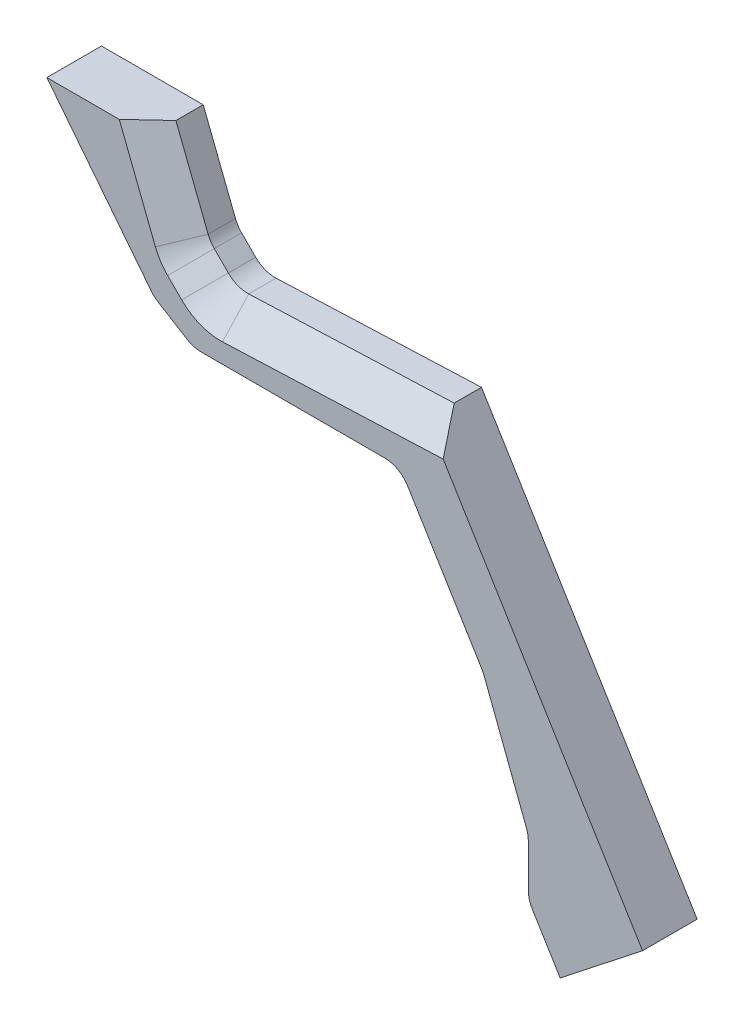
ISO-10303-21;
HEADER;
FILE_DESCRIPTION(('STEP AP214'),'2;1');
FILE_NAME('part.step','',(''),(''),'','','');
FILE_SCHEMA(('AUTOMOTIVE_DESIGN { 1 0 10303 214 1 1 1 1 }'));
ENDSEC;
DATA;
#1=APPLICATION_CONTEXT('core data for automotive mechanical design processes');
#2=APPLICATION_PROTOCOL_DEFINITION('international standard','automotive_design',2000,#1);
#3=PRODUCT_CONTEXT('',#1,'mechanical');
#4=PRODUCT('Part','Part','',(#3));
#5=PRODUCT_RELATED_PRODUCT_CATEGORY('part','',(#4));
#6=PRODUCT_DEFINITION_FORMATION('','',#4);
#7=PRODUCT_DEFINITION_CONTEXT('part definition',#1,'design');
#8=PRODUCT_DEFINITION('design','',#6,#7);
#9=PRODUCT_DEFINITION_SHAPE('','',#8);
#10=(LENGTH_UNIT() NAMED_UNIT(*) SI_UNIT(.MILLI.,.METRE.));
#11=(NAMED_UNIT(*) PLANE_ANGLE_UNIT() SI_UNIT($,.RADIAN.));
#12=(NAMED_UNIT(*) SI_UNIT($,.STERADIAN.) SOLID_ANGLE_UNIT());
#13=UNCERTAINTY_MEASURE_WITH_UNIT(LENGTH_MEASURE(1.E-05),#10,'distance_accuracy_value','');
#14=(GEOMETRIC_REPRESENTATION_CONTEXT(3) GLOBAL_UNCERTAINTY_ASSIGNED_CONTEXT((#13)) GLOBAL_UNIT_ASSIGNED_CONTEXT((#10,
#11,#12)) REPRESENTATION_CONTEXT('',''));
#15=CARTESIAN_POINT('',(0.,0.,0.));
#16=DIRECTION('',(0.,0.,1.));
#17=DIRECTION('',(1.,0.,0.));
#18=AXIS2_PLACEMENT_3D('',#15,#16,#17);
#19=CARTESIAN_POINT('',(656.038853698282,14.6313738858971,-6.35));
#20=DIRECTION('',(0.618333411134521,-0.785915894148189,0.));
#21=DIRECTION('',(0.785915894148189,0.618333411134521,0.));
#22=AXIS2_PLACEMENT_3D('',#19,#20,#21);
#23=PLANE('',#22);
#24=DIRECTION('',(0.,0.,1.));
#25=VECTOR('',#24,1.);
#26=CARTESIAN_POINT('',(675.181083360781,29.6918660480542,-6.35));
#27=LINE('',#26,#25);
#28=CARTESIAN_POINT('',(675.181083360781,29.6918660480542,-6.35));
#29=VERTEX_POINT('',#28);
#30=CARTESIAN_POINT('',(675.181083360781,29.6918660480542,6.35));
#31=VERTEX_POINT('',#30);
#32=EDGE_CURVE('E196',#29,#31,#27,.T.);
#33=ORIENTED_EDGE('',*,*,#32,.T.);
#34=DIRECTION('',(0.785915894148189,0.618333411134521,0.));
#35=VECTOR('',#34,1.);
#36=CARTESIAN_POINT('',(656.038853698282,14.6313738858971,6.35));
#37=LINE('',#36,#35);
#38=CARTESIAN_POINT('',(656.038853698282,14.6313738858971,6.35));
#39=VERTEX_POINT('',#38);
#40=EDGE_CURVE('E200',#39,#31,#37,.T.);
#41=ORIENTED_EDGE('',*,*,#40,.F.);
#42=DIRECTION('',(0.,0.,1.));
#43=VECTOR('',#42,1.);
#44=CARTESIAN_POINT('',(656.038853698282,14.6313738858971,-6.35));
#45=LINE('',#44,#43);
#46=CARTESIAN_POINT('',(656.038853698282,14.6313738858971,-6.35));
#47=VERTEX_POINT('',#46);
#48=EDGE_CURVE('E318',#47,#39,#45,.T.);
#49=ORIENTED_EDGE('',*,*,#48,.F.);
#50=DIRECTION('',(0.785915894148189,0.618333411134521,0.));
#51=VECTOR('',#50,1.);
#52=CARTESIAN_POINT('',(656.038853698282,14.6313738858971,-6.35));
#53=LINE('',#52,#51);
#54=EDGE_CURVE('E202',#47,#29,#53,.T.);
#55=ORIENTED_EDGE('',*,*,#54,.T.);
#56=EDGE_LOOP('',(#33,#41,#49,#55));
#57=FACE_BOUND('',#56,.T.);
#58=ADVANCED_FACE('F33',(#57),#23,.T.);
#59=CARTESIAN_POINT('',(652.382425553719,20.6127664439306,-6.35));
#60=DIRECTION('',(-0.853209935163297,-0.521567643301079,0.));
#61=DIRECTION('',(0.521567643301079,-0.853209935163298,0.));
#62=AXIS2_PLACEMENT_3D('',#59,#60,#61);
#63=PLANE('',#62);
#64=ORIENTED_EDGE('',*,*,#48,.T.);
#65=DIRECTION('',(0.521567643301079,-0.853209935163297,0.));
#66=VECTOR('',#65,1.);
#67=CARTESIAN_POINT('',(649.559170864999,25.231206603803,6.35));
#68=LINE('',#67,#66);
#69=CARTESIAN_POINT('',(649.559170864999,25.231206603803,6.35));
#70=VERTEX_POINT('',#69);
#71=EDGE_CURVE('E221',#70,#39,#68,.T.);
#72=ORIENTED_EDGE('',*,*,#71,.F.);
#73=DIRECTION('',(0.,0.,1.));
#74=VECTOR('',#73,1.);
#75=CARTESIAN_POINT('',(649.559170864999,25.231206603803,-6.35));
#76=LINE('',#75,#74);
#77=CARTESIAN_POINT('',(649.559170864999,25.231206603803,-6.35));
#78=VERTEX_POINT('',#77);
#79=EDGE_CURVE('E321',#78,#70,#76,.T.);
#80=ORIENTED_EDGE('',*,*,#79,.F.);
#81=DIRECTION('',(0.521567643301079,-0.853209935163297,0.));
#82=VECTOR('',#81,1.);
#83=CARTESIAN_POINT('',(649.559170864999,25.231206603803,-6.35));
#84=LINE('',#83,#82);
#85=EDGE_CURVE('E207',#78,#47,#84,.T.);
#86=ORIENTED_EDGE('',*,*,#85,.T.);
#87=EDGE_LOOP('',(#64,#72,#80,#86));
#88=FACE_BOUND('',#87,.T.);
#89=ADVANCED_FACE('F465',(#88),#63,.T.);
#90=CARTESIAN_POINT('',(654.977053953286,28.5431611387648,-6.35));
#91=DIRECTION('',(0.,0.,1.));
#92=DIRECTION('',(1.,0.,0.));
#93=AXIS2_PLACEMENT_3D('',#90,#91,#92);
#94=CYLINDRICAL_SURFACE('',#93,6.34999999999998);
#95=ORIENTED_EDGE('',*,*,#79,.T.);
#96=CARTESIAN_POINT('',(654.977053953286,28.5431611387648,6.35));
#97=DIRECTION('',(0.,0.,1.));
#98=DIRECTION('',(1.,0.,0.));
#99=AXIS2_PLACEMENT_3D('',#96,#97,#98);
#100=CIRCLE('',#99,6.34999999999998);
#101=CARTESIAN_POINT('',(648.627053953286,28.5431611387649,6.35));
#102=VERTEX_POINT('',#101);
#103=EDGE_CURVE('E261',#102,#70,#100,.T.);
#104=ORIENTED_EDGE('',*,*,#103,.F.);
#105=DIRECTION('',(0.,0.,1.));
#106=VECTOR('',#105,1.);
#107=CARTESIAN_POINT('',(648.627053953286,28.5431611387649,-6.35));
#108=LINE('',#107,#106);
#109=CARTESIAN_POINT('',(648.627053953286,28.5431611387649,-6.35));
#110=VERTEX_POINT('',#109);
#111=EDGE_CURVE('E323',#110,#102,#108,.T.);
#112=ORIENTED_EDGE('',*,*,#111,.F.);
#113=CARTESIAN_POINT('',(654.977053953286,28.5431611387648,-6.35));
#114=DIRECTION('',(0.,0.,1.));
#115=DIRECTION('',(1.,0.,0.));
#116=AXIS2_PLACEMENT_3D('',#113,#114,#115);
#117=CIRCLE('',#116,6.34999999999998);
#118=EDGE_CURVE('E314',#110,#78,#117,.T.);
#119=ORIENTED_EDGE('',*,*,#118,.T.);
#120=EDGE_LOOP('',(#95,#104,#112,#119));
#121=FACE_BOUND('',#120,.T.);
#122=ADVANCED_FACE('F462',(#121),#94,.T.);
#123=CARTESIAN_POINT('',(648.627053953286,38.6077307253207,-6.35));
#124=DIRECTION('',(-1.,0.,0.));
#125=DIRECTION('',(0.,0.,1.));
#126=AXIS2_PLACEMENT_3D('',#123,#124,#125);
#127=PLANE('',#126);
#128=ORIENTED_EDGE('',*,*,#111,.T.);
#129=DIRECTION('',(0.,-1.,0.));
#130=VECTOR('',#129,1.);
#131=CARTESIAN_POINT('',(648.627053953286,38.6077307253207,6.35));
#132=LINE('',#131,#130);
#133=CARTESIAN_POINT('',(648.627053953286,38.6077307253207,6.35));
#134=VERTEX_POINT('',#133);
#135=EDGE_CURVE('E258',#134,#102,#132,.T.);
#136=ORIENTED_EDGE('',*,*,#135,.F.);
#137=DIRECTION('',(0.,0.,1.));
#138=VECTOR('',#137,1.);
#139=CARTESIAN_POINT('',(648.627053953286,38.6077307253207,-6.35));
#140=LINE('',#139,#138);
#141=CARTESIAN_POINT('',(648.627053953286,38.6077307253207,-6.35));
#142=VERTEX_POINT('',#141);
#143=EDGE_CURVE('E325',#142,#134,#140,.T.);
#144=ORIENTED_EDGE('',*,*,#143,.F.);
#145=DIRECTION('',(0.,-1.,0.));
#146=VECTOR('',#145,1.);
#147=CARTESIAN_POINT('',(648.627053953286,38.6077307253207,-6.35));
#148=LINE('',#147,#146);
#149=EDGE_CURVE('E311',#142,#110,#148,.T.);
#150=ORIENTED_EDGE('',*,*,#149,.T.);
#151=EDGE_LOOP('',(#128,#136,#144,#150));
#152=FACE_BOUND('',#151,.T.);
#153=ADVANCED_FACE('F458',(#152),#127,.T.);
#154=CARTESIAN_POINT('',(642.277053953286,38.6077307253207,-6.35));
#155=DIRECTION('',(0.,0.,1.));
#156=DIRECTION('',(1.,0.,0.));
#157=AXIS2_PLACEMENT_3D('',#154,#155,#156);
#158=CYLINDRICAL_SURFACE('',#157,6.34999999999999);
#159=ORIENTED_EDGE('',*,*,#143,.T.);
#160=CARTESIAN_POINT('',(642.277053953286,38.6077307253207,6.35));
#161=DIRECTION('',(0.,0.,-1.));
#162=DIRECTION('',(-1.,0.,0.));
#163=AXIS2_PLACEMENT_3D('',#160,#161,#162);
#164=CIRCLE('',#163,6.34999999999999);
#165=CARTESIAN_POINT('',(648.207776972389,40.8768769239341,6.35));
#166=VERTEX_POINT('',#165);
#167=EDGE_CURVE('E255',#166,#134,#164,.T.);
#168=ORIENTED_EDGE('',*,*,#167,.F.);
#169=DIRECTION('',(0.,0.,1.));
#170=VECTOR('',#169,1.);
#171=CARTESIAN_POINT('',(648.207776972389,40.8768769239341,-6.35));
#172=LINE('',#171,#170);
#173=CARTESIAN_POINT('',(648.207776972389,40.8768769239341,-6.35));
#174=VERTEX_POINT('',#173);
#175=EDGE_CURVE('E327',#174,#166,#172,.T.);
#176=ORIENTED_EDGE('',*,*,#175,.F.);
#177=CARTESIAN_POINT('',(642.277053953286,38.6077307253207,-6.35));
#178=DIRECTION('',(0.,0.,-1.));
#179=DIRECTION('',(-1.,0.,0.));
#180=AXIS2_PLACEMENT_3D('',#177,#178,#179);
#181=CIRCLE('',#180,6.34999999999999);
#182=EDGE_CURVE('E308',#174,#142,#181,.T.);
#183=ORIENTED_EDGE('',*,*,#182,.T.);
#184=EDGE_LOOP('',(#159,#168,#176,#183));
#185=FACE_BOUND('',#184,.T.);
#186=ADVANCED_FACE('F456',(#185),#158,.F.);
#187=CARTESIAN_POINT('',(638.313826656792,66.7360652487895,-6.35));
#188=DIRECTION('',(-0.933972128992602,-0.35734585804935,0.));
#189=DIRECTION('',(0.35734585804935,-0.933972128992602,0.));
#190=AXIS2_PLACEMENT_3D('',#187,#188,#189);
#191=PLANE('',#190);
#192=ORIENTED_EDGE('',*,*,#175,.T.);
#193=DIRECTION('',(0.35734585804935,-0.933972128992602,0.));
#194=VECTOR('',#193,1.);
#195=CARTESIAN_POINT('',(638.313826656792,66.7360652487895,6.35));
#196=LINE('',#195,#194);
#197=CARTESIAN_POINT('',(638.313826656792,66.7360652487895,6.35));
#198=VERTEX_POINT('',#197);
#199=EDGE_CURVE('E252',#198,#166,#196,.T.);
#200=ORIENTED_EDGE('',*,*,#199,.F.);
#201=DIRECTION('',(0.,0.,1.));
#202=VECTOR('',#201,1.);
#203=CARTESIAN_POINT('',(638.313826656792,66.7360652487895,-6.35));
#204=LINE('',#203,#202);
#205=CARTESIAN_POINT('',(638.313826656792,66.7360652487895,-6.35));
#206=VERTEX_POINT('',#205);
#207=EDGE_CURVE('E329',#206,#198,#204,.T.);
#208=ORIENTED_EDGE('',*,*,#207,.F.);
#209=DIRECTION('',(0.35734585804935,-0.933972128992602,0.));
#210=VECTOR('',#209,1.);
#211=CARTESIAN_POINT('',(638.313826656792,66.7360652487895,-6.35));
#212=LINE('',#211,#210);
#213=EDGE_CURVE('E305',#206,#174,#212,.T.);
#214=ORIENTED_EDGE('',*,*,#213,.T.);
#215=EDGE_LOOP('',(#192,#200,#208,#214));
#216=FACE_BOUND('',#215,.T.);
#217=ADVANCED_FACE('F451',(#216),#191,.T.);
#218=CARTESIAN_POINT('',(632.383103637689,64.4669190501762,-6.35));
#219=DIRECTION('',(0.,0.,1.));
#220=DIRECTION('',(1.,0.,0.));
#221=AXIS2_PLACEMENT_3D('',#218,#219,#220);
#222=CYLINDRICAL_SURFACE('',#221,6.35);
#223=ORIENTED_EDGE('',*,*,#207,.T.);
#224=CARTESIAN_POINT('',(632.383103637689,64.4669190501762,6.35));
#225=DIRECTION('',(0.,0.,-1.));
#226=DIRECTION('',(-1.,0.,0.));
#227=AXIS2_PLACEMENT_3D('',#224,#225,#226);
#228=CIRCLE('',#227,6.35);
#229=CARTESIAN_POINT('',(637.800986725976,67.7788735851381,6.35));
#230=VERTEX_POINT('',#229);
#231=EDGE_CURVE('E249',#230,#198,#228,.T.);
#232=ORIENTED_EDGE('',*,*,#231,.F.);
#233=DIRECTION('',(0.,0.,1.));
#234=VECTOR('',#233,1.);
#235=CARTESIAN_POINT('',(637.800986725976,67.7788735851381,-6.35));
#236=LINE('',#235,#234);
#237=CARTESIAN_POINT('',(637.800986725976,67.7788735851381,-6.35));
#238=VERTEX_POINT('',#237);
#239=EDGE_CURVE('E331',#238,#230,#236,.T.);
#240=ORIENTED_EDGE('',*,*,#239,.F.);
#241=CARTESIAN_POINT('',(632.383103637689,64.4669190501762,-6.35));
#242=DIRECTION('',(0.,0.,-1.));
#243=DIRECTION('',(-1.,0.,0.));
#244=AXIS2_PLACEMENT_3D('',#241,#242,#243);
#245=CIRCLE('',#244,6.35);
#246=EDGE_CURVE('E302',#238,#206,#245,.T.);
#247=ORIENTED_EDGE('',*,*,#246,.T.);
#248=EDGE_LOOP('',(#223,#232,#240,#247));
#249=FACE_BOUND('',#248,.T.);
#250=ADVANCED_FACE('F446',(#249),#222,.F.);
#251=CARTESIAN_POINT('',(620.612705275723,95.8964393315885,-6.35));
#252=DIRECTION('',(-0.853209935163297,-0.52156764330108,0.));
#253=DIRECTION('',(0.52156764330108,-0.853209935163297,0.));
#254=AXIS2_PLACEMENT_3D('',#251,#252,#253);
#255=PLANE('',#254);
#256=ORIENTED_EDGE('',*,*,#239,.T.);
#257=DIRECTION('',(0.52156764330108,-0.853209935163297,0.));
#258=VECTOR('',#257,1.);
#259=CARTESIAN_POINT('',(620.612705275723,95.8964393315885,6.35));
#260=LINE('',#259,#258);
#261=CARTESIAN_POINT('',(620.612705275723,95.8964393315885,6.35));
#262=VERTEX_POINT('',#261);
#263=EDGE_CURVE('E246',#262,#230,#260,.T.);
#264=ORIENTED_EDGE('',*,*,#263,.F.);
#265=DIRECTION('',(0.,0.,1.));
#266=VECTOR('',#265,1.);
#267=CARTESIAN_POINT('',(620.612705275723,95.8964393315885,-6.35));
#268=LINE('',#267,#266);
#269=CARTESIAN_POINT('',(620.612705275723,95.8964393315885,-6.35));
#270=VERTEX_POINT('',#269);
#271=EDGE_CURVE('E333',#270,#262,#268,.T.);
#272=ORIENTED_EDGE('',*,*,#271,.F.);
#273=DIRECTION('',(0.52156764330108,-0.853209935163297,0.));
#274=VECTOR('',#273,1.);
#275=CARTESIAN_POINT('',(620.612705275723,95.8964393315885,-6.35));
#276=LINE('',#275,#274);
#277=EDGE_CURVE('E299',#270,#238,#276,.T.);
#278=ORIENTED_EDGE('',*,*,#277,.T.);
#279=EDGE_LOOP('',(#256,#264,#272,#278));
#280=FACE_BOUND('',#279,.T.);
#281=ADVANCED_FACE('F444',(#280),#255,.T.);
#282=CARTESIAN_POINT('',(615.194822187436,92.5844847966267,-6.35));
#283=DIRECTION('',(0.,0.,1.));
#284=DIRECTION('',(1.,0.,0.));
#285=AXIS2_PLACEMENT_3D('',#282,#283,#284);
#286=CYLINDRICAL_SURFACE('',#285,6.34999999999999);
#287=ORIENTED_EDGE('',*,*,#271,.T.);
#288=CARTESIAN_POINT('',(615.194822187436,92.5844847966267,6.35));
#289=DIRECTION('',(0.,0.,-1.));
#290=DIRECTION('',(-1.,0.,0.));
#291=AXIS2_PLACEMENT_3D('',#288,#289,#290);
#292=CIRCLE('',#291,6.34999999999999);
#293=CARTESIAN_POINT('',(615.194822187436,98.9344847966267,6.35));
#294=VERTEX_POINT('',#293);
#295=EDGE_CURVE('E243',#294,#262,#292,.T.);
#296=ORIENTED_EDGE('',*,*,#295,.F.);
#297=DIRECTION('',(0.,0.,1.));
#298=VECTOR('',#297,1.);
#299=CARTESIAN_POINT('',(615.194822187436,98.9344847966267,-6.35));
#300=LINE('',#299,#298);
#301=CARTESIAN_POINT('',(615.194822187436,98.9344847966267,-6.35));
#302=VERTEX_POINT('',#301);
#303=EDGE_CURVE('E335',#302,#294,#300,.T.);
#304=ORIENTED_EDGE('',*,*,#303,.F.);
#305=CARTESIAN_POINT('',(615.194822187436,92.5844847966267,-6.35));
#306=DIRECTION('',(0.,0.,-1.));
#307=DIRECTION('',(-1.,0.,0.));
#308=AXIS2_PLACEMENT_3D('',#305,#306,#307);
#309=CIRCLE('',#308,6.34999999999999);
#310=EDGE_CURVE('E296',#302,#270,#309,.T.);
#311=ORIENTED_EDGE('',*,*,#310,.T.);
#312=EDGE_LOOP('',(#287,#296,#304,#311));
#313=FACE_BOUND('',#312,.T.);
#314=ADVANCED_FACE('F439',(#313),#286,.F.);
#315=CARTESIAN_POINT('',(572.593645862706,98.9344847966267,-6.35));
#316=DIRECTION('',(0.,-1.,0.));
#317=DIRECTION('',(0.,0.,-1.));
#318=AXIS2_PLACEMENT_3D('',#315,#316,#317);
#319=PLANE('',#318);
#320=ORIENTED_EDGE('',*,*,#303,.T.);
#321=DIRECTION('',(1.,0.,0.));
#322=VECTOR('',#321,1.);
#323=CARTESIAN_POINT('',(572.593645862706,98.9344847966267,6.35));
#324=LINE('',#323,#322);
#325=CARTESIAN_POINT('',(572.593645862706,98.9344847966267,6.35));
#326=VERTEX_POINT('',#325);
#327=EDGE_CURVE('E240',#326,#294,#324,.T.);
#328=ORIENTED_EDGE('',*,*,#327,.F.);
#329=DIRECTION('',(0.,0.,1.));
#330=VECTOR('',#329,1.);
#331=CARTESIAN_POINT('',(572.593645862706,98.9344847966267,-6.35));
#332=LINE('',#331,#330);
#333=CARTESIAN_POINT('',(572.593645862706,98.9344847966267,-6.35));
#334=VERTEX_POINT('',#333);
#335=EDGE_CURVE('E337',#334,#326,#332,.T.);
#336=ORIENTED_EDGE('',*,*,#335,.F.);
#337=DIRECTION('',(1.,0.,0.));
#338=VECTOR('',#337,1.);
#339=CARTESIAN_POINT('',(572.593645862706,98.9344847966267,-6.35));
#340=LINE('',#339,#338);
#341=EDGE_CURVE('E293',#334,#302,#340,.T.);
#342=ORIENTED_EDGE('',*,*,#341,.T.);
#343=EDGE_LOOP('',(#320,#328,#336,#342));
#344=FACE_BOUND('',#343,.T.);
#345=ADVANCED_FACE('F432',(#344),#319,.T.);
#346=CARTESIAN_POINT('',(572.593645862706,105.284484796627,-6.35));
#347=DIRECTION('',(0.,0.,1.));
#348=DIRECTION('',(1.,0.,0.));
#349=AXIS2_PLACEMENT_3D('',#346,#347,#348);
#350=CYLINDRICAL_SURFACE('',#349,6.35);
#351=ORIENTED_EDGE('',*,*,#335,.T.);
#352=CARTESIAN_POINT('',(572.593645862706,105.284484796627,6.35));
#353=DIRECTION('',(0.,0.,1.));
#354=DIRECTION('',(1.,0.,0.));
#355=AXIS2_PLACEMENT_3D('',#352,#353,#354);
#356=CIRCLE('',#355,6.35);
#357=CARTESIAN_POINT('',(569.27760598159,99.8691011992398,6.35));
#358=VERTEX_POINT('',#357);
#359=EDGE_CURVE('E237',#358,#326,#356,.T.);
#360=ORIENTED_EDGE('',*,*,#359,.F.);
#361=DIRECTION('',(0.,0.,1.));
#362=VECTOR('',#361,1.);
#363=CARTESIAN_POINT('',(569.27760598159,99.8691011992398,-6.35));
#364=LINE('',#363,#362);
#365=CARTESIAN_POINT('',(569.27760598159,99.8691011992398,-6.35));
#366=VERTEX_POINT('',#365);
#367=EDGE_CURVE('E339',#366,#358,#364,.T.);
#368=ORIENTED_EDGE('',*,*,#367,.F.);
#369=CARTESIAN_POINT('',(572.593645862706,105.284484796627,-6.35));
#370=DIRECTION('',(0.,0.,1.));
#371=DIRECTION('',(1.,0.,0.));
#372=AXIS2_PLACEMENT_3D('',#369,#370,#371);
#373=CIRCLE('',#372,6.35);
#374=EDGE_CURVE('E290',#366,#334,#373,.T.);
#375=ORIENTED_EDGE('',*,*,#374,.T.);
#376=EDGE_LOOP('',(#351,#360,#368,#375));
#377=FACE_BOUND('',#376,.T.);
#378=ADVANCED_FACE('F428',(#377),#350,.T.);
#379=CARTESIAN_POINT('',(562.617631944932,103.94724988725,-6.35));
#380=DIRECTION('',(-0.52221100490018,-0.85281631454912,0.));
#381=DIRECTION('',(0.852816314549121,-0.52221100490018,0.));
#382=AXIS2_PLACEMENT_3D('',#379,#380,#381);
#383=PLANE('',#382);
#384=ORIENTED_EDGE('',*,*,#367,.T.);
#385=DIRECTION('',(0.85281631454912,-0.52221100490018,0.));
#386=VECTOR('',#385,1.);
#387=CARTESIAN_POINT('',(562.617631944932,103.94724988725,6.35));
#388=LINE('',#387,#386);
#389=CARTESIAN_POINT('',(562.617631944932,103.94724988725,6.35));
#390=VERTEX_POINT('',#389);
#391=EDGE_CURVE('E234',#390,#358,#388,.T.);
#392=ORIENTED_EDGE('',*,*,#391,.F.);
#393=DIRECTION('',(0.,0.,1.));
#394=VECTOR('',#393,1.);
#395=CARTESIAN_POINT('',(562.617631944932,103.94724988725,-6.35));
#396=LINE('',#395,#394);
#397=CARTESIAN_POINT('',(562.617631944932,103.94724988725,-6.35));
#398=VERTEX_POINT('',#397);
#399=EDGE_CURVE('E341',#398,#390,#396,.T.);
#400=ORIENTED_EDGE('',*,*,#399,.F.);
#401=DIRECTION('',(0.85281631454912,-0.52221100490018,0.));
#402=VECTOR('',#401,1.);
#403=CARTESIAN_POINT('',(562.617631944932,103.94724988725,-6.35));
#404=LINE('',#403,#402);
#405=EDGE_CURVE('E287',#398,#366,#404,.T.);
#406=ORIENTED_EDGE('',*,*,#405,.T.);
#407=EDGE_LOOP('',(#384,#392,#400,#406));
#408=FACE_BOUND('',#407,.T.);
#409=ADVANCED_FACE('F424',(#408),#383,.T.);
#410=CARTESIAN_POINT('',(565.933671826049,109.362633484637,-6.35));
#411=DIRECTION('',(0.,0.,1.));
#412=DIRECTION('',(1.,0.,0.));
#413=AXIS2_PLACEMENT_3D('',#410,#411,#412);
#414=CYLINDRICAL_SURFACE('',#413,6.34999999999999);
#415=ORIENTED_EDGE('',*,*,#399,.T.);
#416=CARTESIAN_POINT('',(565.933671826049,109.362633484637,6.35));
#417=DIRECTION('',(0.,0.,-1.));
#418=DIRECTION('',(-1.,0.,0.));
#419=AXIS2_PLACEMENT_3D('',#416,#417,#418);
#420=CIRCLE('',#419,6.34999999999999);
#421=CARTESIAN_POINT('',(560.943105898208,105.436216323933,6.35));
#422=VERTEX_POINT('',#421);
#423=EDGE_CURVE('E231',#390,#422,#420,.T.);
#424=ORIENTED_EDGE('',*,*,#423,.T.);
#425=DIRECTION('',(0.,0.,1.));
#426=VECTOR('',#425,1.);
#427=CARTESIAN_POINT('',(560.943105898208,105.436216323933,-6.35));
#428=LINE('',#427,#426);
#429=CARTESIAN_POINT('',(560.943105898208,105.436216323933,-6.35));
#430=VERTEX_POINT('',#429);
#431=EDGE_CURVE('E343',#430,#422,#428,.T.);
#432=ORIENTED_EDGE('',*,*,#431,.F.);
#433=CARTESIAN_POINT('',(565.933671826049,109.362633484637,-6.35));
#434=DIRECTION('',(0.,0.,-1.));
#435=DIRECTION('',(-1.,0.,0.));
#436=AXIS2_PLACEMENT_3D('',#433,#434,#435);
#437=CIRCLE('',#436,6.34999999999999);
#438=EDGE_CURVE('E285',#398,#430,#437,.T.);
#439=ORIENTED_EDGE('',*,*,#438,.F.);
#440=EDGE_LOOP('',(#415,#424,#432,#439));
#441=FACE_BOUND('',#440,.T.);
#442=ADVANCED_FACE('F419',(#441),#414,.T.);
#443=CARTESIAN_POINT('',(536.695979738912,136.254867706594,-6.35));
#444=DIRECTION('',(-0.785915894148189,-0.618333411134521,0.));
#445=DIRECTION('',(0.618333411134521,-0.785915894148189,0.));
#446=AXIS2_PLACEMENT_3D('',#443,#444,#445);
#447=PLANE('',#446);
#448=ORIENTED_EDGE('',*,*,#431,.T.);
#449=DIRECTION('',(0.618333411134521,-0.785915894148189,0.));
#450=VECTOR('',#449,1.);
#451=CARTESIAN_POINT('',(536.695979738912,136.254867706594,6.35));
#452=LINE('',#451,#450);
#453=CARTESIAN_POINT('',(536.695979738912,136.254867706594,6.35));
#454=VERTEX_POINT('',#453);
#455=EDGE_CURVE('E228',#454,#422,#452,.T.);
#456=ORIENTED_EDGE('',*,*,#455,.F.);
#457=DIRECTION('',(0.,0.,1.));
#458=VECTOR('',#457,1.);
#459=CARTESIAN_POINT('',(536.695979738912,136.254867706594,-6.35));
#460=LINE('',#459,#458);
#461=CARTESIAN_POINT('',(536.695979738912,136.254867706594,-6.35));
#462=VERTEX_POINT('',#461);
#463=EDGE_CURVE('E345',#462,#454,#460,.T.);
#464=ORIENTED_EDGE('',*,*,#463,.F.);
#465=DIRECTION('',(0.618333411134521,-0.785915894148189,0.));
#466=VECTOR('',#465,1.);
#467=CARTESIAN_POINT('',(536.695979738912,136.254867706594,-6.35));
#468=LINE('',#467,#466);
#469=EDGE_CURVE('E282',#462,#430,#468,.T.);
#470=ORIENTED_EDGE('',*,*,#469,.T.);
#471=EDGE_LOOP('',(#448,#456,#464,#470));
#472=FACE_BOUND('',#471,.T.);
#473=ADVANCED_FACE('F415',(#472),#447,.T.);
#474=CARTESIAN_POINT('',(536.695979738912,136.254867706594,-6.35));
#475=DIRECTION('',(0.,-1.,0.));
#476=DIRECTION('',(0.,0.,-1.));
#477=AXIS2_PLACEMENT_3D('',#474,#475,#476);
#478=PLANE('',#477);
#479=DIRECTION('',(1.,0.,0.));
#480=VECTOR('',#479,1.);
#481=CARTESIAN_POINT('',(536.695979738912,136.254867706594,6.35));
#482=LINE('',#481,#480);
#483=CARTESIAN_POINT('',(553.530241341378,136.254867706594,6.35));
#484=VERTEX_POINT('',#483);
#485=EDGE_CURVE('E215',#454,#484,#482,.T.);
#486=ORIENTED_EDGE('',*,*,#485,.T.);
#487=DIRECTION('',(-0.731833129954581,0.,0.681483873544254));
#488=VECTOR('',#487,1.);
#489=CARTESIAN_POINT('',(558.857203444181,136.254867706594,1.38952660865897));
#490=LINE('',#489,#488);
#491=CARTESIAN_POINT('',(560.349390782204,136.254867706594,0.));
#492=VERTEX_POINT('',#491);
#493=EDGE_CURVE('E371',#484,#492,#490,.F.);
#494=ORIENTED_EDGE('',*,*,#493,.T.);
#495=DIRECTION('',(0.,0.,1.));
#496=VECTOR('',#495,1.);
#497=CARTESIAN_POINT('',(560.349390782204,136.254867706594,-6.35));
#498=LINE('',#497,#496);
#499=CARTESIAN_POINT('',(560.349390782204,136.254867706594,-6.35));
#500=VERTEX_POINT('',#499);
#501=EDGE_CURVE('E347',#500,#492,#498,.T.);
#502=ORIENTED_EDGE('',*,*,#501,.F.);
#503=DIRECTION('',(1.,0.,0.));
#504=VECTOR('',#503,1.);
#505=CARTESIAN_POINT('',(536.695979738912,136.254867706594,-6.35));
#506=LINE('',#505,#504);
#507=EDGE_CURVE('E280',#462,#500,#506,.T.);
#508=ORIENTED_EDGE('',*,*,#507,.F.);
#509=ORIENTED_EDGE('',*,*,#463,.T.);
#510=EDGE_LOOP('',(#486,#494,#502,#508,#509));
#511=FACE_BOUND('',#510,.T.);
#512=ADVANCED_FACE('F409',(#511),#478,.F.);
#513=CARTESIAN_POINT('',(567.845871294064,117.103637483191,-6.35));
#514=DIRECTION('',(0.931201179135663,0.364505643270924,0.));
#515=DIRECTION('',(-0.364505643270924,0.931201179135663,0.));
#516=AXIS2_PLACEMENT_3D('',#513,#514,#515);
#517=PLANE('',#516);
#518=ORIENTED_EDGE('',*,*,#501,.T.);
#519=DIRECTION('',(0.364505643270924,-0.931201179135663,0.));
#520=VECTOR('',#519,1.);
#521=CARTESIAN_POINT('',(567.845871294064,117.103637483191,0.));
#522=LINE('',#521,#520);
#523=CARTESIAN_POINT('',(567.845871294064,117.103637483191,0.));
#524=VERTEX_POINT('',#523);
#525=EDGE_CURVE('E373',#492,#524,#522,.T.);
#526=ORIENTED_EDGE('',*,*,#525,.T.);
#527=DIRECTION('',(0.,0.,1.));
#528=VECTOR('',#527,1.);
#529=CARTESIAN_POINT('',(567.845871294064,117.103637483191,-6.35));
#530=LINE('',#529,#528);
#531=CARTESIAN_POINT('',(567.845871294064,117.103637483191,-6.35));
#532=VERTEX_POINT('',#531);
#533=EDGE_CURVE('E350',#532,#524,#530,.T.);
#534=ORIENTED_EDGE('',*,*,#533,.F.);
#535=DIRECTION('',(-0.364505643270924,0.931201179135663,0.));
#536=VECTOR('',#535,1.);
#537=CARTESIAN_POINT('',(567.845871294064,117.103637483191,-6.35));
#538=LINE('',#537,#536);
#539=EDGE_CURVE('E277',#532,#500,#538,.T.);
#540=ORIENTED_EDGE('',*,*,#539,.T.);
#541=EDGE_LOOP('',(#518,#526,#534,#540));
#542=FACE_BOUND('',#541,.T.);
#543=ADVANCED_FACE('F479',(#542),#517,.T.);
#544=CARTESIAN_POINT('',(573.758998781575,119.418248317962,-6.35));
#545=DIRECTION('',(0.,0.,1.));
#546=DIRECTION('',(1.,0.,0.));
#547=AXIS2_PLACEMENT_3D('',#544,#545,#546);
#548=CYLINDRICAL_SURFACE('',#547,6.35000000000001);
#549=ORIENTED_EDGE('',*,*,#533,.T.);
#550=CARTESIAN_POINT('',(573.758998781575,119.418248317962,0.));
#551=DIRECTION('',(0.,0.,1.));
#552=DIRECTION('',(1.,0.,0.));
#553=AXIS2_PLACEMENT_3D('',#550,#551,#552);
#554=CIRCLE('',#553,6.35000000000001);
#555=CARTESIAN_POINT('',(569.268870721041,114.928120257427,0.));
#556=VERTEX_POINT('',#555);
#557=EDGE_CURVE('E375',#524,#556,#554,.T.);
#558=ORIENTED_EDGE('',*,*,#557,.T.);
#559=DIRECTION('',(0.,0.,1.));
#560=VECTOR('',#559,1.);
#561=CARTESIAN_POINT('',(569.268870721041,114.928120257427,-6.35));
#562=LINE('',#561,#560);
#563=CARTESIAN_POINT('',(569.268870721041,114.928120257427,-6.35));
#564=VERTEX_POINT('',#563);
#565=EDGE_CURVE('E353',#564,#556,#562,.T.);
#566=ORIENTED_EDGE('',*,*,#565,.F.);
#567=CARTESIAN_POINT('',(573.758998781575,119.418248317962,-6.35));
#568=DIRECTION('',(0.,0.,-1.));
#569=DIRECTION('',(-1.,0.,0.));
#570=AXIS2_PLACEMENT_3D('',#567,#568,#569);
#571=CIRCLE('',#570,6.35000000000001);
#572=EDGE_CURVE('E274',#564,#532,#571,.T.);
#573=ORIENTED_EDGE('',*,*,#572,.T.);
#574=EDGE_LOOP('',(#549,#558,#566,#573));
#575=FACE_BOUND('',#574,.T.);
#576=ADVANCED_FACE('F477',(#575),#548,.F.);
#577=CARTESIAN_POINT('',(569.268870721041,114.928120257427,-6.35));
#578=DIRECTION('',(-0.707106781186544,-0.70710678118655,0.));
#579=DIRECTION('',(0.707106781186551,-0.707106781186545,0.));
#580=AXIS2_PLACEMENT_3D('',#577,#578,#579);
#581=PLANE('',#580);
#582=ORIENTED_EDGE('',*,*,#565,.T.);
#583=DIRECTION('',(0.707106781186551,-0.707106781186545,0.));
#584=VECTOR('',#583,1.);
#585=CARTESIAN_POINT('',(572.537308132363,111.659682846105,0.));
#586=LINE('',#585,#584);
#587=CARTESIAN_POINT('',(572.537308132363,111.659682846105,0.));
#588=VERTEX_POINT('',#587);
#589=EDGE_CURVE('E377',#556,#588,#586,.T.);
#590=ORIENTED_EDGE('',*,*,#589,.T.);
#591=DIRECTION('',(0.,0.,1.));
#592=VECTOR('',#591,1.);
#593=CARTESIAN_POINT('',(572.537308132363,111.659682846105,-6.35));
#594=LINE('',#593,#592);
#595=CARTESIAN_POINT('',(572.537308132363,111.659682846105,-6.35));
#596=VERTEX_POINT('',#595);
#597=EDGE_CURVE('E356',#596,#588,#594,.T.);
#598=ORIENTED_EDGE('',*,*,#597,.F.);
#599=DIRECTION('',(0.707106781186551,-0.707106781186545,0.));
#600=VECTOR('',#599,1.);
#601=CARTESIAN_POINT('',(569.268870721041,114.928120257427,-6.35));
#602=LINE('',#601,#600);
#603=EDGE_CURVE('E272',#564,#596,#602,.T.);
#604=ORIENTED_EDGE('',*,*,#603,.F.);
#605=EDGE_LOOP('',(#582,#590,#598,#604));
#606=FACE_BOUND('',#605,.T.);
#607=ADVANCED_FACE('F475',(#606),#581,.F.);
#608=CARTESIAN_POINT('',(577.027436192897,116.149810906639,-6.35));
#609=DIRECTION('',(0.,0.,1.));
#610=DIRECTION('',(1.,0.,0.));
#611=AXIS2_PLACEMENT_3D('',#608,#609,#610);
#612=CYLINDRICAL_SURFACE('',#611,6.34999999999997);
#613=ORIENTED_EDGE('',*,*,#597,.T.);
#614=CARTESIAN_POINT('',(577.027436192897,116.149810906639,0.));
#615=DIRECTION('',(0.,0.,1.));
#616=DIRECTION('',(1.,0.,0.));
#617=AXIS2_PLACEMENT_3D('',#614,#615,#616);
#618=CIRCLE('',#617,6.34999999999997);
#619=CARTESIAN_POINT('',(577.280315142883,109.804848161543,0.));
#620=VERTEX_POINT('',#619);
#621=EDGE_CURVE('E57',#588,#620,#618,.T.);
#622=ORIENTED_EDGE('',*,*,#621,.T.);
#623=DIRECTION('',(0.,0.,1.));
#624=VECTOR('',#623,1.);
#625=CARTESIAN_POINT('',(577.280315142883,109.804848161543,-6.35));
#626=LINE('',#625,#624);
#627=CARTESIAN_POINT('',(577.280315142883,109.804848161543,-6.35));
#628=VERTEX_POINT('',#627);
#629=EDGE_CURVE('E358',#628,#620,#626,.T.);
#630=ORIENTED_EDGE('',*,*,#629,.F.);
#631=CARTESIAN_POINT('',(577.027436192897,116.149810906639,-6.35));
#632=DIRECTION('',(0.,0.,1.));
#633=DIRECTION('',(1.,0.,0.));
#634=AXIS2_PLACEMENT_3D('',#631,#632,#633);
#635=CIRCLE('',#634,6.34999999999997);
#636=EDGE_CURVE('E270',#596,#628,#635,.T.);
#637=ORIENTED_EDGE('',*,*,#636,.F.);
#638=EDGE_LOOP('',(#613,#622,#630,#637));
#639=FACE_BOUND('',#638,.T.);
#640=ADVANCED_FACE('F469',(#639),#612,.F.);
#641=CARTESIAN_POINT('',(625.044285008542,111.708484641696,-6.35));
#642=DIRECTION('',(-0.0398234566906522,0.999206731511156,0.));
#643=DIRECTION('',(-0.999206731511156,-0.0398234566906522,0.));
#644=AXIS2_PLACEMENT_3D('',#641,#642,#643);
#645=PLANE('',#644);
#646=ORIENTED_EDGE('',*,*,#629,.T.);
#647=DIRECTION('',(0.999206731511156,0.0398234566906522,0.));
#648=VECTOR('',#647,1.);
#649=CARTESIAN_POINT('',(625.044285008542,111.708484641696,0.));
#650=LINE('',#649,#648);
#651=CARTESIAN_POINT('',(625.044285008542,111.708484641696,0.));
#652=VERTEX_POINT('',#651);
#653=EDGE_CURVE('E42',#620,#652,#650,.T.);
#654=ORIENTED_EDGE('',*,*,#653,.T.);
#655=DIRECTION('',(0.,0.,1.));
#656=VECTOR('',#655,1.);
#657=CARTESIAN_POINT('',(625.044285008542,111.708484641696,-6.35));
#658=LINE('',#657,#656);
#659=CARTESIAN_POINT('',(625.044285008542,111.708484641696,-6.35));
#660=VERTEX_POINT('',#659);
#661=EDGE_CURVE('E206',#660,#652,#658,.T.);
#662=ORIENTED_EDGE('',*,*,#661,.F.);
#663=DIRECTION('',(-0.999206731511156,-0.0398234566906522,0.));
#664=VECTOR('',#663,1.);
#665=CARTESIAN_POINT('',(625.044285008542,111.708484641696,-6.35));
#666=LINE('',#665,#664);
#667=EDGE_CURVE('E267',#660,#628,#666,.T.);
#668=ORIENTED_EDGE('',*,*,#667,.T.);
#669=EDGE_LOOP('',(#646,#654,#662,#668));
#670=FACE_BOUND('',#669,.T.);
#671=ADVANCED_FACE('F467',(#670),#645,.T.);
#672=CARTESIAN_POINT('',(675.181083360781,29.6918660480542,-6.35));
#673=DIRECTION('',(0.853209935163297,0.521567643301081,0.));
#674=DIRECTION('',(-0.521567643301081,0.853209935163297,0.));
#675=AXIS2_PLACEMENT_3D('',#672,#673,#674);
#676=PLANE('',#675);
#677=ORIENTED_EDGE('',*,*,#661,.T.);
#678=DIRECTION('',(-0.392849711248692,0.642645840800228,-0.657780683567089));
#679=VECTOR('',#678,1.);
#680=CARTESIAN_POINT('',(651.847225848834,67.8627137043098,44.8783752226685));
#681=LINE('',#680,#679);
#682=CARTESIAN_POINT('',(628.83672788312,105.504591473305,6.35));
#683=VERTEX_POINT('',#682);
#684=EDGE_CURVE('E11',#652,#683,#681,.F.);
#685=ORIENTED_EDGE('',*,*,#684,.T.);
#686=DIRECTION('',(-0.521567643301081,0.853209935163297,0.));
#687=VECTOR('',#686,1.);
#688=CARTESIAN_POINT('',(675.181083360781,29.6918660480542,6.35));
#689=LINE('',#688,#687);
#690=EDGE_CURVE('E210',#31,#683,#689,.T.);
#691=ORIENTED_EDGE('',*,*,#690,.F.);
#692=ORIENTED_EDGE('',*,*,#32,.F.);
#693=DIRECTION('',(-0.521567643301081,0.853209935163297,0.));
#694=VECTOR('',#693,1.);
#695=CARTESIAN_POINT('',(675.181083360781,29.6918660480542,-6.35));
#696=LINE('',#695,#694);
#697=EDGE_CURVE('E265',#29,#660,#696,.T.);
#698=ORIENTED_EDGE('',*,*,#697,.T.);
#699=EDGE_LOOP('',(#677,#685,#691,#692,#698));
#700=FACE_BOUND('',#699,.T.);
#701=ADVANCED_FACE('F211',(#700),#676,.T.);
#702=CARTESIAN_POINT('',(577.027436192897,116.149810906639,-6.35));
#703=DIRECTION('',(0.,0.,1.));
#704=DIRECTION('',(1.,0.,0.));
#705=AXIS2_PLACEMENT_3D('',#702,#703,#704);
#706=PLANE('',#705);
#707=ORIENTED_EDGE('',*,*,#54,.F.);
#708=ORIENTED_EDGE('',*,*,#85,.F.);
#709=ORIENTED_EDGE('',*,*,#118,.F.);
#710=ORIENTED_EDGE('',*,*,#149,.F.);
#711=ORIENTED_EDGE('',*,*,#182,.F.);
#712=ORIENTED_EDGE('',*,*,#213,.F.);
#713=ORIENTED_EDGE('',*,*,#246,.F.);
#714=ORIENTED_EDGE('',*,*,#277,.F.);
#715=ORIENTED_EDGE('',*,*,#310,.F.);
#716=ORIENTED_EDGE('',*,*,#341,.F.);
#717=ORIENTED_EDGE('',*,*,#374,.F.);
#718=ORIENTED_EDGE('',*,*,#405,.F.);
#719=ORIENTED_EDGE('',*,*,#438,.T.);
#720=ORIENTED_EDGE('',*,*,#469,.F.);
#721=ORIENTED_EDGE('',*,*,#507,.T.);
#722=ORIENTED_EDGE('',*,*,#539,.F.);
#723=ORIENTED_EDGE('',*,*,#572,.F.);
#724=ORIENTED_EDGE('',*,*,#603,.T.);
#725=ORIENTED_EDGE('',*,*,#636,.T.);
#726=ORIENTED_EDGE('',*,*,#667,.F.);
#727=ORIENTED_EDGE('',*,*,#697,.F.);
#728=EDGE_LOOP('',(#707,#708,#709,#710,#711,#712,#713,#714,#715,#716,#717,#718,#719,#720,#721,
#722,#723,#724,#725,#726,#727));
#729=FACE_BOUND('',#728,.T.);
#730=ADVANCED_FACE('F435',(#729),#706,.F.);
#731=CARTESIAN_POINT('',(577.027436192897,116.149810906639,6.35));
#732=DIRECTION('',(0.,0.,1.));
#733=DIRECTION('',(1.,0.,0.));
#734=AXIS2_PLACEMENT_3D('',#731,#732,#733);
#735=PLANE('',#734);
#736=CARTESIAN_POINT('',(573.758998781575,119.418248317962,6.35));
#737=DIRECTION('',(0.,0.,1.));
#738=DIRECTION('',(1.,0.,0.));
#739=AXIS2_PLACEMENT_3D('',#736,#737,#738);
#740=CIRCLE('',#739,12.7);
#741=CARTESIAN_POINT('',(564.778742660506,110.437992196892,6.35));
#742=VERTEX_POINT('',#741);
#743=CARTESIAN_POINT('',(561.932743806552,114.789026648421,6.35));
#744=VERTEX_POINT('',#743);
#745=EDGE_CURVE('E366',#742,#744,#740,.F.);
#746=ORIENTED_EDGE('',*,*,#745,.T.);
#747=DIRECTION('',(-0.364505643270924,0.931201179135663,0.));
#748=VECTOR('',#747,1.);
#749=CARTESIAN_POINT('',(563.476402115268,110.845448644086,6.35));
#750=LINE('',#749,#748);
#751=EDGE_CURVE('E368',#744,#484,#750,.T.);
#752=ORIENTED_EDGE('',*,*,#751,.T.);
#753=ORIENTED_EDGE('',*,*,#485,.F.);
#754=ORIENTED_EDGE('',*,*,#455,.T.);
#755=ORIENTED_EDGE('',*,*,#423,.F.);
#756=ORIENTED_EDGE('',*,*,#391,.T.);
#757=ORIENTED_EDGE('',*,*,#359,.T.);
#758=ORIENTED_EDGE('',*,*,#327,.T.);
#759=ORIENTED_EDGE('',*,*,#295,.T.);
#760=ORIENTED_EDGE('',*,*,#263,.T.);
#761=ORIENTED_EDGE('',*,*,#231,.T.);
#762=ORIENTED_EDGE('',*,*,#199,.T.);
#763=ORIENTED_EDGE('',*,*,#167,.T.);
#764=ORIENTED_EDGE('',*,*,#135,.T.);
#765=ORIENTED_EDGE('',*,*,#103,.T.);
#766=ORIENTED_EDGE('',*,*,#71,.T.);
#767=ORIENTED_EDGE('',*,*,#40,.T.);
#768=ORIENTED_EDGE('',*,*,#690,.T.);
#769=DIRECTION('',(-0.999206731511156,-0.0398234566906522,0.));
#770=VECTOR('',#769,1.);
#771=CARTESIAN_POINT('',(577.533194092869,103.459885416448,6.35));
#772=LINE('',#771,#770);
#773=CARTESIAN_POINT('',(577.533194092869,103.459885416448,6.35));
#774=VERTEX_POINT('',#773);
#775=EDGE_CURVE('E320',#683,#774,#772,.T.);
#776=ORIENTED_EDGE('',*,*,#775,.T.);
#777=CARTESIAN_POINT('',(577.027436192897,116.149810906639,6.35));
#778=DIRECTION('',(0.,0.,1.));
#779=DIRECTION('',(1.,0.,0.));
#780=AXIS2_PLACEMENT_3D('',#777,#778,#779);
#781=CIRCLE('',#780,12.7);
#782=CARTESIAN_POINT('',(568.047180071828,107.16955478557,6.35));
#783=VERTEX_POINT('',#782);
#784=EDGE_CURVE('E362',#774,#783,#781,.F.);
#785=ORIENTED_EDGE('',*,*,#784,.T.);
#786=DIRECTION('',(-0.707106781186551,0.707106781186545,0.));
#787=VECTOR('',#786,1.);
#788=CARTESIAN_POINT('',(564.778742660506,110.437992196892,6.35));
#789=LINE('',#788,#787);
#790=EDGE_CURVE('E364',#783,#742,#789,.T.);
#791=ORIENTED_EDGE('',*,*,#790,.T.);
#792=EDGE_LOOP('',(#746,#752,#753,#754,#755,#756,#757,#758,#759,#760,#761,#762,#763,#764,#765,
#766,#767,#768,#776,#785,#791));
#793=FACE_BOUND('',#792,.T.);
#794=ADVANCED_FACE('F218',(#793),#735,.T.);
#795=CARTESIAN_POINT('',(577.533194092869,103.459885416448,6.35));
#796=DIRECTION('',(0.0281594362762491,-0.706545855658788,-0.707106781186544));
#797=DIRECTION('',(-0.999206731511156,-0.0398234566906522,0.));
#798=AXIS2_PLACEMENT_3D('',#795,#796,#797);
#799=PLANE('',#798);
#800=ORIENTED_EDGE('',*,*,#684,.F.);
#801=ORIENTED_EDGE('',*,*,#653,.F.);
#802=DIRECTION('',(-0.0281594362762569,0.706545855658781,-0.707106781186551));
#803=VECTOR('',#802,1.);
#804=CARTESIAN_POINT('',(577.533194092869,103.459885416448,6.35));
#805=LINE('',#804,#803);
#806=EDGE_CURVE('E37',#774,#620,#805,.T.);
#807=ORIENTED_EDGE('',*,*,#806,.F.);
#808=ORIENTED_EDGE('',*,*,#775,.F.);
#809=EDGE_LOOP('',(#800,#801,#807,#808));
#810=FACE_BOUND('',#809,.T.);
#811=ADVANCED_FACE('F35',(#810),#799,.F.);
#812=CARTESIAN_POINT('',(577.027436192897,116.149810906639,0.));
#813=DIRECTION('',(0.,0.,1.));
#814=DIRECTION('',(1.,0.,0.));
#815=AXIS2_PLACEMENT_3D('',#812,#813,#814);
#816=CONICAL_SURFACE('',#815,6.34999999999997,0.785398163397444);
#817=ORIENTED_EDGE('',*,*,#806,.T.);
#818=ORIENTED_EDGE('',*,*,#621,.F.);
#819=DIRECTION('',(0.499999999999992,0.500000000000001,-0.707106781186553));
#820=VECTOR('',#819,1.);
#821=CARTESIAN_POINT('',(568.047180071828,107.16955478557,6.35));
#822=LINE('',#821,#820);
#823=EDGE_CURVE('E224',#783,#588,#822,.T.);
#824=ORIENTED_EDGE('',*,*,#823,.F.);
#825=ORIENTED_EDGE('',*,*,#784,.F.);
#826=EDGE_LOOP('',(#817,#818,#824,#825));
#827=FACE_BOUND('',#826,.T.);
#828=ADVANCED_FACE('F395',(#827),#816,.F.);
#829=CARTESIAN_POINT('',(569.268870721041,114.928120257427,0.));
#830=DIRECTION('',(0.500000000000003,0.500000000000007,0.707106781186541));
#831=DIRECTION('',(-0.707106781186551,0.707106781186545,0.));
#832=AXIS2_PLACEMENT_3D('',#829,#830,#831);
#833=PLANE('',#832);
#834=ORIENTED_EDGE('',*,*,#823,.T.);
#835=ORIENTED_EDGE('',*,*,#589,.F.);
#836=DIRECTION('',(0.499999999999991,0.500000000000003,-0.707106781186552));
#837=VECTOR('',#836,1.);
#838=CARTESIAN_POINT('',(564.778742660506,110.437992196892,6.35));
#839=LINE('',#838,#837);
#840=EDGE_CURVE('E384',#742,#556,#839,.T.);
#841=ORIENTED_EDGE('',*,*,#840,.F.);
#842=ORIENTED_EDGE('',*,*,#790,.F.);
#843=EDGE_LOOP('',(#834,#835,#841,#842));
#844=FACE_BOUND('',#843,.T.);
#845=ADVANCED_FACE('F391',(#844),#833,.T.);
#846=CARTESIAN_POINT('',(573.758998781575,119.418248317962,6.35));
#847=DIRECTION('',(0.,0.,1.));
#848=DIRECTION('',(1.,0.,0.));
#849=AXIS2_PLACEMENT_3D('',#846,#847,#848);
#850=CONICAL_SURFACE('',#849,12.7,0.785398163397442);
#851=ORIENTED_EDGE('',*,*,#840,.T.);
#852=ORIENTED_EDGE('',*,*,#557,.F.);
#853=DIRECTION('',(0.658458668415736,0.257744412137633,-0.707106781186549));
#854=VECTOR('',#853,1.);
#855=CARTESIAN_POINT('',(561.932743806552,114.789026648421,6.35));
#856=LINE('',#855,#854);
#857=EDGE_CURVE('E381',#744,#524,#856,.T.);
#858=ORIENTED_EDGE('',*,*,#857,.F.);
#859=ORIENTED_EDGE('',*,*,#745,.F.);
#860=EDGE_LOOP('',(#851,#852,#858,#859));
#861=FACE_BOUND('',#860,.T.);
#862=ADVANCED_FACE('F402',(#861),#850,.F.);
#863=CARTESIAN_POINT('',(563.476402115268,110.845448644086,6.35));
#864=DIRECTION('',(-0.658458668415739,-0.257744412137636,-0.707106781186545));
#865=DIRECTION('',(-0.364505643270924,0.931201179135663,0.));
#866=AXIS2_PLACEMENT_3D('',#863,#864,#865);
#867=PLANE('',#866);
#868=ORIENTED_EDGE('',*,*,#857,.T.);
#869=ORIENTED_EDGE('',*,*,#525,.F.);
#870=ORIENTED_EDGE('',*,*,#493,.F.);
#871=ORIENTED_EDGE('',*,*,#751,.F.);
#872=EDGE_LOOP('',(#868,#869,#870,#871));
#873=FACE_BOUND('',#872,.T.);
#874=ADVANCED_FACE('F406',(#873),#867,.F.);
#875=CLOSED_SHELL('',(#58,#89,#122,#153,#186,#217,#250,#281,#314,#345,#378,#409,#442,#473,#512,
#543,#576,#607,#640,#671,#701,#730,#794,#811,#828,#845,#862,#874));
#876=MANIFOLD_SOLID_BREP('B2',#875);
#877=ADVANCED_BREP_SHAPE_REPRESENTATION('',(#18,#876),#14);
#878=SHAPE_DEFINITION_REPRESENTATION(#9,#877);
ENDSEC;
END-ISO-10303-21;
